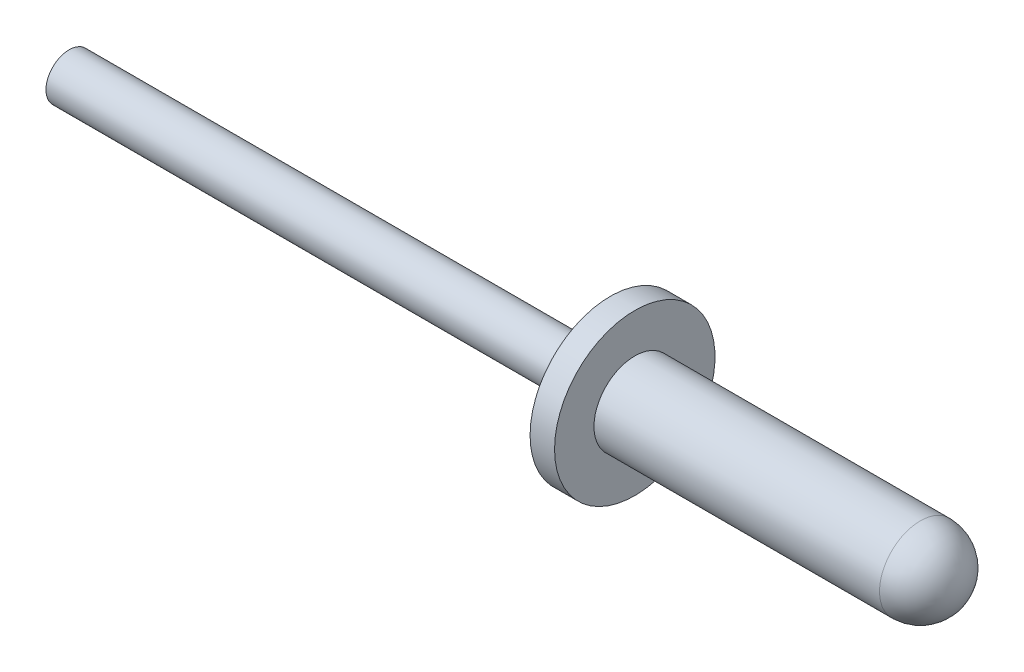
ISO-10303-21;
HEADER;
FILE_DESCRIPTION(('STEP AP214'),'2;1');
FILE_NAME('part.step','',(''),(''),'','','');
FILE_SCHEMA(('AUTOMOTIVE_DESIGN { 1 0 10303 214 1 1 1 1 }'));
ENDSEC;
DATA;
#1=APPLICATION_CONTEXT('core data for automotive mechanical design processes');
#2=APPLICATION_PROTOCOL_DEFINITION('international standard','automotive_design',2000,#1);
#3=PRODUCT_CONTEXT('',#1,'mechanical');
#4=PRODUCT('Part','Part','',(#3));
#5=PRODUCT_RELATED_PRODUCT_CATEGORY('part','',(#4));
#6=PRODUCT_DEFINITION_FORMATION('','',#4);
#7=PRODUCT_DEFINITION_CONTEXT('part definition',#1,'design');
#8=PRODUCT_DEFINITION('design','',#6,#7);
#9=PRODUCT_DEFINITION_SHAPE('','',#8);
#10=(LENGTH_UNIT() NAMED_UNIT(*) SI_UNIT(.MILLI.,.METRE.));
#11=(NAMED_UNIT(*) PLANE_ANGLE_UNIT() SI_UNIT($,.RADIAN.));
#12=(NAMED_UNIT(*) SI_UNIT($,.STERADIAN.) SOLID_ANGLE_UNIT());
#13=UNCERTAINTY_MEASURE_WITH_UNIT(LENGTH_MEASURE(1.E-05),#10,'distance_accuracy_value','');
#14=(GEOMETRIC_REPRESENTATION_CONTEXT(3) GLOBAL_UNCERTAINTY_ASSIGNED_CONTEXT((#13)) GLOBAL_UNIT_ASSIGNED_CONTEXT((#10,
#11,#12)) REPRESENTATION_CONTEXT('',''));
#15=CARTESIAN_POINT('',(0.,0.,0.));
#16=DIRECTION('',(0.,0.,1.));
#17=DIRECTION('',(1.,0.,0.));
#18=AXIS2_PLACEMENT_3D('',#15,#16,#17);
#19=CARTESIAN_POINT('',(10.5,0.,0.));
#20=DIRECTION('',(-1.,0.,0.));
#21=DIRECTION('',(0.,0.,1.));
#22=AXIS2_PLACEMENT_3D('',#19,#20,#21);
#23=CYLINDRICAL_SURFACE('',#22,1.5);
#24=CARTESIAN_POINT('',(10.5,0.,0.));
#25=DIRECTION('',(1.,0.,0.));
#26=DIRECTION('',(0.,0.,-1.));
#27=AXIS2_PLACEMENT_3D('',#24,#25,#26);
#28=CIRCLE('',#27,1.5);
#29=CARTESIAN_POINT('',(10.5,0.,1.5));
#30=VERTEX_POINT('',#29);
#31=EDGE_CURVE('E54',#30,#30,#28,.T.);
#32=CARTESIAN_POINT('',(0.,0.,0.));
#33=DIRECTION('',(1.,0.,0.));
#34=DIRECTION('',(0.,0.,-1.));
#35=AXIS2_PLACEMENT_3D('',#32,#33,#34);
#36=CIRCLE('',#35,1.5);
#37=CARTESIAN_POINT('',(0.,0.,1.5));
#38=VERTEX_POINT('',#37);
#39=EDGE_CURVE('E49',#38,#38,#36,.T.);
#40=CARTESIAN_POINT('',(10.5,0.,1.5));
#41=CARTESIAN_POINT('',(10.390625,0.,1.5));
#42=CARTESIAN_POINT('',(10.28125,0.,1.5));
#43=CARTESIAN_POINT('',(10.0625,0.,1.5));
#44=CARTESIAN_POINT('',(9.953125,0.,1.5));
#45=CARTESIAN_POINT('',(9.734375,0.,1.5));
#46=CARTESIAN_POINT('',(9.625,0.,1.5));
#47=CARTESIAN_POINT('',(9.40625,0.,1.5));
#48=CARTESIAN_POINT('',(9.296875,0.,1.5));
#49=CARTESIAN_POINT('',(9.078125,0.,1.5));
#50=CARTESIAN_POINT('',(8.96875,0.,1.5));
#51=CARTESIAN_POINT('',(8.75,0.,1.5));
#52=CARTESIAN_POINT('',(8.640625,0.,1.5));
#53=CARTESIAN_POINT('',(8.421875,0.,1.5));
#54=CARTESIAN_POINT('',(8.3125,0.,1.5));
#55=CARTESIAN_POINT('',(8.09375,0.,1.5));
#56=CARTESIAN_POINT('',(7.984375,0.,1.5));
#57=CARTESIAN_POINT('',(7.765625,0.,1.5));
#58=CARTESIAN_POINT('',(7.65625,0.,1.5));
#59=CARTESIAN_POINT('',(7.4375,0.,1.5));
#60=CARTESIAN_POINT('',(7.328125,0.,1.5));
#61=CARTESIAN_POINT('',(7.109375,0.,1.5));
#62=CARTESIAN_POINT('',(7.,0.,1.5));
#63=CARTESIAN_POINT('',(6.78125,0.,1.5));
#64=CARTESIAN_POINT('',(6.671875,0.,1.5));
#65=CARTESIAN_POINT('',(6.453125,0.,1.5));
#66=CARTESIAN_POINT('',(6.34375,0.,1.5));
#67=CARTESIAN_POINT('',(6.125,0.,1.5));
#68=CARTESIAN_POINT('',(6.015625,0.,1.5));
#69=CARTESIAN_POINT('',(5.796875,0.,1.5));
#70=CARTESIAN_POINT('',(5.6875,0.,1.5));
#71=CARTESIAN_POINT('',(5.46875,0.,1.5));
#72=CARTESIAN_POINT('',(5.359375,0.,1.5));
#73=CARTESIAN_POINT('',(5.140625,0.,1.5));
#74=CARTESIAN_POINT('',(5.03125,0.,1.5));
#75=CARTESIAN_POINT('',(4.8125,0.,1.5));
#76=CARTESIAN_POINT('',(4.703125,0.,1.5));
#77=CARTESIAN_POINT('',(4.484375,0.,1.5));
#78=CARTESIAN_POINT('',(4.375,0.,1.5));
#79=CARTESIAN_POINT('',(4.15625,0.,1.5));
#80=CARTESIAN_POINT('',(4.046875,0.,1.5));
#81=CARTESIAN_POINT('',(3.828125,0.,1.5));
#82=CARTESIAN_POINT('',(3.71875,0.,1.5));
#83=CARTESIAN_POINT('',(3.5,0.,1.5));
#84=CARTESIAN_POINT('',(3.390625,0.,1.5));
#85=CARTESIAN_POINT('',(3.171875,0.,1.5));
#86=CARTESIAN_POINT('',(3.0625,0.,1.5));
#87=CARTESIAN_POINT('',(2.84375,0.,1.5));
#88=CARTESIAN_POINT('',(2.734375,0.,1.5));
#89=CARTESIAN_POINT('',(2.515625,0.,1.5));
#90=CARTESIAN_POINT('',(2.40625,0.,1.5));
#91=CARTESIAN_POINT('',(2.1875,0.,1.5));
#92=CARTESIAN_POINT('',(2.078125,0.,1.5));
#93=CARTESIAN_POINT('',(1.859375,0.,1.5));
#94=CARTESIAN_POINT('',(1.75,0.,1.5));
#95=CARTESIAN_POINT('',(1.53125,0.,1.5));
#96=CARTESIAN_POINT('',(1.421875,0.,1.5));
#97=CARTESIAN_POINT('',(1.203125,0.,1.5));
#98=CARTESIAN_POINT('',(1.09375,0.,1.5));
#99=CARTESIAN_POINT('',(0.875000000000001,0.,1.5));
#100=CARTESIAN_POINT('',(0.765625000000001,0.,1.5));
#101=CARTESIAN_POINT('',(0.546875,0.,1.5));
#102=CARTESIAN_POINT('',(0.4375,0.,1.5));
#103=CARTESIAN_POINT('',(0.21875,0.,1.5));
#104=CARTESIAN_POINT('',(0.109375,0.,1.5));
#105=CARTESIAN_POINT('',(0.,0.,1.5));
#106=B_SPLINE_CURVE_WITH_KNOTS('',3,(#40,#41,#42,#43,#44,#45,#46,#47,#48,#49,#50,#51,#52,#53,
#54,#55,#56,#57,#58,#59,#60,#61,#62,#63,#64,#65,#66,#67,#68,#69,#70,#71,#72,#73,#74,#75,#76,#77,
#78,#79,#80,#81,#82,#83,#84,#85,#86,#87,#88,#89,#90,#91,#92,#93,#94,#95,#96,#97,#98,#99,#100,
#101,#102,#103,#104,#105),.UNSPECIFIED.,.F.,.F.,(4,2,2,2,2,2,2,2,2,2,2,2,2,2,2,2,2,2,2,2,2,2,2,
2,2,2,2,2,2,2,2,2,4),(0.,0.328124999999999,0.656249999999999,0.984374999999999,1.3125,1.640625,
1.96875,2.296875,2.625,2.953125,3.28125,3.609375,3.9375,4.265625,4.59375,4.921875,5.25,5.578125,
5.90625,6.234375,6.5625,6.890625,7.21875,7.546875,7.875,8.203125,8.53125,8.859375,9.1875,
9.515625,9.84375,10.171875,10.5),.UNSPECIFIED.);
#107=EDGE_CURVE('BSEAM46',#30,#38,#106,.T.);
#108=ORIENTED_EDGE('',*,*,#31,.F.);
#109=ORIENTED_EDGE('',*,*,#39,.T.);
#110=ORIENTED_EDGE('',*,*,#107,.T.);
#111=ORIENTED_EDGE('',*,*,#107,.F.);
#112=EDGE_LOOP('',(#108,#110,#109,#111));
#113=FACE_BOUND('',#112,.T.);
#114=ADVANCED_FACE('F46',(#113),#23,.T.);
#115=CARTESIAN_POINT('',(10.5,0.,0.));
#116=DIRECTION('',(0.,0.,-1.));
#117=DIRECTION('',(0.,-1.,0.));
#118=AXIS2_PLACEMENT_3D('',#115,#116,#117);
#119=SPHERICAL_SURFACE('',#118,1.5);
#120=CARTESIAN_POINT('',(10.5,0.,0.));
#121=DIRECTION('',(1.,0.,0.));
#122=DIRECTION('',(0.,0.,-1.));
#123=AXIS2_PLACEMENT_3D('',#120,#121,#122);
#124=SPHERICAL_SURFACE('',#123,1.5);
#125=ORIENTED_EDGE('',*,*,#31,.T.);
#126=EDGE_LOOP('',(#125));
#127=FACE_BOUND('',#126,.T.);
#128=ADVANCED_FACE('F91',(#127),#124,.T.);
#129=CARTESIAN_POINT('',(-0.9,0.,0.));
#130=DIRECTION('',(1.,0.,0.));
#131=DIRECTION('',(0.,0.,-1.));
#132=AXIS2_PLACEMENT_3D('',#129,#130,#131);
#133=CYLINDRICAL_SURFACE('',#132,2.95);
#134=CARTESIAN_POINT('',(-0.9,0.,0.));
#135=DIRECTION('',(-1.,0.,0.));
#136=DIRECTION('',(0.,0.,1.));
#137=AXIS2_PLACEMENT_3D('',#134,#135,#136);
#138=CIRCLE('',#137,2.95);
#139=CARTESIAN_POINT('',(-0.9,0.,2.95));
#140=VERTEX_POINT('',#139);
#141=EDGE_CURVE('E67',#140,#140,#138,.T.);
#142=ORIENTED_EDGE('',*,*,#141,.F.);
#143=EDGE_LOOP('',(#142));
#144=FACE_BOUND('',#143,.T.);
#145=CARTESIAN_POINT('',(0.,0.,0.));
#146=DIRECTION('',(-1.,0.,0.));
#147=DIRECTION('',(0.,0.,1.));
#148=AXIS2_PLACEMENT_3D('',#145,#146,#147);
#149=CIRCLE('',#148,2.95);
#150=CARTESIAN_POINT('',(0.,0.,2.95));
#151=VERTEX_POINT('',#150);
#152=EDGE_CURVE('E63',#151,#151,#149,.T.);
#153=ORIENTED_EDGE('',*,*,#152,.T.);
#154=EDGE_LOOP('',(#153));
#155=FACE_BOUND('',#154,.T.);
#156=ADVANCED_FACE('F89',(#144,#155),#133,.T.);
#157=CARTESIAN_POINT('',(-0.9,0.,0.));
#158=DIRECTION('',(-1.,0.,0.));
#159=DIRECTION('',(0.,0.,1.));
#160=AXIS2_PLACEMENT_3D('',#157,#158,#159);
#161=PLANE('',#160);
#162=CARTESIAN_POINT('',(-0.9,0.,0.));
#163=DIRECTION('',(-1.,0.,0.));
#164=DIRECTION('',(0.,-1.,0.));
#165=AXIS2_PLACEMENT_3D('',#162,#163,#164);
#166=CIRCLE('',#165,0.85);
#167=CARTESIAN_POINT('',(-0.9,-0.85,0.));
#168=VERTEX_POINT('',#167);
#169=EDGE_CURVE('E12',#168,#168,#166,.T.);
#170=ORIENTED_EDGE('',*,*,#169,.F.);
#171=EDGE_LOOP('',(#170));
#172=FACE_BOUND('',#171,.T.);
#173=ORIENTED_EDGE('',*,*,#141,.T.);
#174=EDGE_LOOP('',(#173));
#175=FACE_BOUND('',#174,.T.);
#176=ADVANCED_FACE('F84',(#172,#175),#161,.T.);
#177=CARTESIAN_POINT('',(0.,0.,0.));
#178=DIRECTION('',(-1.,0.,0.));
#179=DIRECTION('',(0.,0.,1.));
#180=AXIS2_PLACEMENT_3D('',#177,#178,#179);
#181=PLANE('',#180);
#182=ORIENTED_EDGE('',*,*,#39,.F.);
#183=EDGE_LOOP('',(#182));
#184=FACE_BOUND('',#183,.T.);
#185=ORIENTED_EDGE('',*,*,#152,.F.);
#186=EDGE_LOOP('',(#185));
#187=FACE_BOUND('',#186,.T.);
#188=ADVANCED_FACE('F81',(#184,#187),#181,.F.);
#189=CARTESIAN_POINT('',(-20.8,0.,0.));
#190=DIRECTION('',(-1.,0.,0.));
#191=DIRECTION('',(0.,-1.,0.));
#192=AXIS2_PLACEMENT_3D('',#189,#190,#191);
#193=PLANE('',#192);
#194=CARTESIAN_POINT('',(-20.8,0.,0.));
#195=DIRECTION('',(-1.,0.,0.));
#196=DIRECTION('',(0.,-1.,0.));
#197=AXIS2_PLACEMENT_3D('',#194,#195,#196);
#198=CIRCLE('',#197,0.85);
#199=CARTESIAN_POINT('',(-20.8,-0.850000000000002,0.));
#200=VERTEX_POINT('',#199);
#201=EDGE_CURVE('E59',#200,#200,#198,.T.);
#202=ORIENTED_EDGE('',*,*,#201,.T.);
#203=EDGE_LOOP('',(#202));
#204=FACE_BOUND('',#203,.T.);
#205=ADVANCED_FACE('F60',(#204),#193,.T.);
#206=CARTESIAN_POINT('',(-0.9,0.,0.));
#207=DIRECTION('',(-1.,0.,0.));
#208=DIRECTION('',(0.,-1.,0.));
#209=AXIS2_PLACEMENT_3D('',#206,#207,#208);
#210=CYLINDRICAL_SURFACE('',#209,0.85);
#211=ORIENTED_EDGE('',*,*,#201,.F.);
#212=EDGE_LOOP('',(#211));
#213=FACE_BOUND('',#212,.T.);
#214=ORIENTED_EDGE('',*,*,#169,.T.);
#215=EDGE_LOOP('',(#214));
#216=FACE_BOUND('',#215,.T.);
#217=ADVANCED_FACE('F86',(#213,#216),#210,.T.);
#218=CLOSED_SHELL('',(#114,#128,#156,#176,#188,#205,#217));
#219=MANIFOLD_SOLID_BREP('B2',#218);
#220=ADVANCED_BREP_SHAPE_REPRESENTATION('',(#18,#219),#14);
#221=SHAPE_DEFINITION_REPRESENTATION(#9,#220);
ENDSEC;
END-ISO-10303-21;
